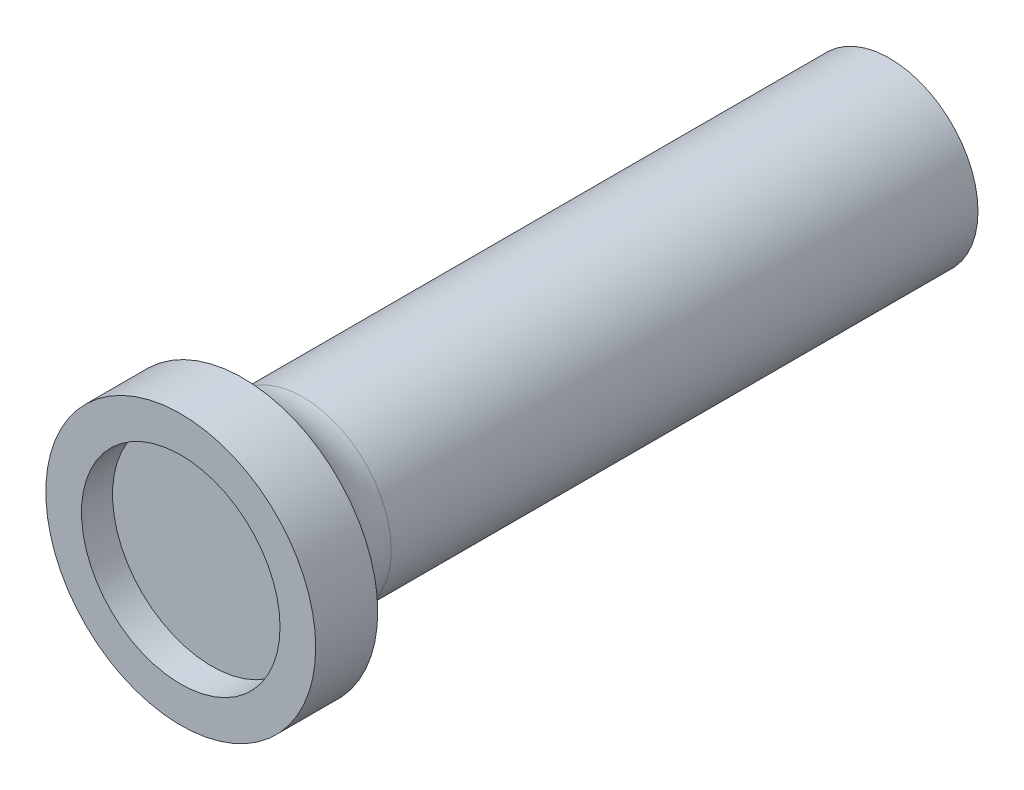
ISO-10303-21;
HEADER;
FILE_DESCRIPTION(('STEP AP214'),'2;1');
FILE_NAME('part.step','',(''),(''),'','','');
FILE_SCHEMA(('AUTOMOTIVE_DESIGN { 1 0 10303 214 1 1 1 1 }'));
ENDSEC;
DATA;
#1=APPLICATION_CONTEXT('core data for automotive mechanical design processes');
#2=APPLICATION_PROTOCOL_DEFINITION('international standard','automotive_design',2000,#1);
#3=PRODUCT_CONTEXT('',#1,'mechanical');
#4=PRODUCT('Part','Part','',(#3));
#5=PRODUCT_RELATED_PRODUCT_CATEGORY('part','',(#4));
#6=PRODUCT_DEFINITION_FORMATION('','',#4);
#7=PRODUCT_DEFINITION_CONTEXT('part definition',#1,'design');
#8=PRODUCT_DEFINITION('design','',#6,#7);
#9=PRODUCT_DEFINITION_SHAPE('','',#8);
#10=(LENGTH_UNIT() NAMED_UNIT(*) SI_UNIT(.MILLI.,.METRE.));
#11=(NAMED_UNIT(*) PLANE_ANGLE_UNIT() SI_UNIT($,.RADIAN.));
#12=(NAMED_UNIT(*) SI_UNIT($,.STERADIAN.) SOLID_ANGLE_UNIT());
#13=UNCERTAINTY_MEASURE_WITH_UNIT(LENGTH_MEASURE(1.E-05),#10,'distance_accuracy_value','');
#14=(GEOMETRIC_REPRESENTATION_CONTEXT(3) GLOBAL_UNCERTAINTY_ASSIGNED_CONTEXT((#13)) GLOBAL_UNIT_ASSIGNED_CONTEXT((#10,
#11,#12)) REPRESENTATION_CONTEXT('',''));
#15=CARTESIAN_POINT('',(0.,0.,0.));
#16=DIRECTION('',(0.,0.,1.));
#17=DIRECTION('',(1.,0.,0.));
#18=AXIS2_PLACEMENT_3D('',#15,#16,#17);
#19=CARTESIAN_POINT('',(0.,0.,20.85));
#20=DIRECTION('',(0.,0.,-1.));
#21=DIRECTION('',(-1.,0.,0.));
#22=AXIS2_PLACEMENT_3D('',#19,#20,#21);
#23=CYLINDRICAL_SURFACE('',#22,2.85);
#24=CARTESIAN_POINT('',(0.,0.,18.9135083268963));
#25=DIRECTION('',(0.,0.,1.));
#26=DIRECTION('',(1.,0.,0.));
#27=AXIS2_PLACEMENT_3D('',#24,#25,#26);
#28=CIRCLE('',#27,2.85);
#29=CARTESIAN_POINT('',(2.85,0.,18.9135083268963));
#30=VERTEX_POINT('',#29);
#31=EDGE_CURVE('E34',#30,#30,#28,.F.);
#32=ORIENTED_EDGE('',*,*,#31,.T.);
#33=EDGE_LOOP('',(#32));
#34=FACE_BOUND('',#33,.T.);
#35=CARTESIAN_POINT('',(0.,0.,0.));
#36=DIRECTION('',(0.,0.,1.));
#37=DIRECTION('',(1.,0.,0.));
#38=AXIS2_PLACEMENT_3D('',#35,#36,#37);
#39=CIRCLE('',#38,2.85);
#40=CARTESIAN_POINT('',(2.85,0.,0.));
#41=VERTEX_POINT('',#40);
#42=EDGE_CURVE('E42',#41,#41,#39,.T.);
#43=ORIENTED_EDGE('',*,*,#42,.T.);
#44=EDGE_LOOP('',(#43));
#45=FACE_BOUND('',#44,.T.);
#46=ADVANCED_FACE('F30',(#34,#45),#23,.T.);
#47=CARTESIAN_POINT('',(0.,0.,0.));
#48=DIRECTION('',(0.,0.,1.));
#49=DIRECTION('',(1.,0.,0.));
#50=AXIS2_PLACEMENT_3D('',#47,#48,#49);
#51=PLANE('',#50);
#52=CARTESIAN_POINT('',(0.,0.,0.));
#53=DIRECTION('',(0.,0.,-1.));
#54=DIRECTION('',(-1.,0.,0.));
#55=AXIS2_PLACEMENT_3D('',#52,#53,#54);
#56=CIRCLE('',#55,0.8);
#57=CARTESIAN_POINT('',(-0.8,0.,0.));
#58=VERTEX_POINT('',#57);
#59=EDGE_CURVE('E10',#58,#58,#56,.T.);
#60=ORIENTED_EDGE('',*,*,#59,.F.);
#61=EDGE_LOOP('',(#60));
#62=FACE_BOUND('',#61,.T.);
#63=ORIENTED_EDGE('',*,*,#42,.F.);
#64=EDGE_LOOP('',(#63));
#65=FACE_BOUND('',#64,.T.);
#66=ADVANCED_FACE('F61',(#62,#65),#51,.F.);
#67=CARTESIAN_POINT('',(0.,0.,22.85));
#68=DIRECTION('',(0.,0.,-1.));
#69=DIRECTION('',(-1.,0.,0.));
#70=AXIS2_PLACEMENT_3D('',#67,#68,#69);
#71=CYLINDRICAL_SURFACE('',#70,4.35);
#72=CARTESIAN_POINT('',(0.,0.,22.85));
#73=DIRECTION('',(0.,0.,1.));
#74=DIRECTION('',(1.,0.,0.));
#75=AXIS2_PLACEMENT_3D('',#72,#73,#74);
#76=CIRCLE('',#75,4.35);
#77=CARTESIAN_POINT('',(4.35,0.,22.85));
#78=VERTEX_POINT('',#77);
#79=EDGE_CURVE('E53',#78,#78,#76,.T.);
#80=ORIENTED_EDGE('',*,*,#79,.F.);
#81=EDGE_LOOP('',(#80));
#82=FACE_BOUND('',#81,.T.);
#83=CARTESIAN_POINT('',(0.,0.,20.85));
#84=DIRECTION('',(0.,0.,1.));
#85=DIRECTION('',(1.,0.,0.));
#86=AXIS2_PLACEMENT_3D('',#83,#84,#85);
#87=CIRCLE('',#86,4.35);
#88=CARTESIAN_POINT('',(4.35,0.,20.85));
#89=VERTEX_POINT('',#88);
#90=EDGE_CURVE('E49',#89,#89,#87,.T.);
#91=ORIENTED_EDGE('',*,*,#90,.T.);
#92=EDGE_LOOP('',(#91));
#93=FACE_BOUND('',#92,.T.);
#94=ADVANCED_FACE('F63',(#82,#93),#71,.T.);
#95=CARTESIAN_POINT('',(0.,0.,22.85));
#96=DIRECTION('',(0.,0.,1.));
#97=DIRECTION('',(1.,0.,0.));
#98=AXIS2_PLACEMENT_3D('',#95,#96,#97);
#99=PLANE('',#98);
#100=CARTESIAN_POINT('',(0.,0.,22.85));
#101=DIRECTION('',(0.,0.,1.));
#102=DIRECTION('',(1.,0.,0.));
#103=AXIS2_PLACEMENT_3D('',#100,#101,#102);
#104=CIRCLE('',#103,3.2);
#105=CARTESIAN_POINT('',(3.2,0.,22.85));
#106=VERTEX_POINT('',#105);
#107=EDGE_CURVE('E50',#106,#106,#104,.T.);
#108=ORIENTED_EDGE('',*,*,#107,.F.);
#109=EDGE_LOOP('',(#108));
#110=FACE_BOUND('',#109,.T.);
#111=ORIENTED_EDGE('',*,*,#79,.T.);
#112=EDGE_LOOP('',(#111));
#113=FACE_BOUND('',#112,.T.);
#114=ADVANCED_FACE('F70',(#110,#113),#99,.T.);
#115=CARTESIAN_POINT('',(0.,0.,21.85));
#116=DIRECTION('',(0.,0.,1.));
#117=DIRECTION('',(1.,0.,0.));
#118=AXIS2_PLACEMENT_3D('',#115,#116,#117);
#119=CYLINDRICAL_SURFACE('',#118,3.2);
#120=CARTESIAN_POINT('',(0.,0.,21.85));
#121=DIRECTION('',(0.,0.,1.));
#122=DIRECTION('',(1.,0.,0.));
#123=AXIS2_PLACEMENT_3D('',#120,#121,#122);
#124=CIRCLE('',#123,3.2);
#125=CARTESIAN_POINT('',(3.2,0.,21.85));
#126=VERTEX_POINT('',#125);
#127=EDGE_CURVE('E46',#126,#126,#124,.T.);
#128=ORIENTED_EDGE('',*,*,#127,.F.);
#129=EDGE_LOOP('',(#128));
#130=FACE_BOUND('',#129,.T.);
#131=ORIENTED_EDGE('',*,*,#107,.T.);
#132=EDGE_LOOP('',(#131));
#133=FACE_BOUND('',#132,.T.);
#134=ADVANCED_FACE('F77',(#130,#133),#119,.F.);
#135=CARTESIAN_POINT('',(0.,0.,21.85));
#136=DIRECTION('',(0.,0.,1.));
#137=DIRECTION('',(1.,0.,0.));
#138=AXIS2_PLACEMENT_3D('',#135,#136,#137);
#139=PLANE('',#138);
#140=ORIENTED_EDGE('',*,*,#127,.T.);
#141=EDGE_LOOP('',(#140));
#142=FACE_BOUND('',#141,.T.);
#143=ADVANCED_FACE('F81',(#142),#139,.T.);
#144=CARTESIAN_POINT('',(0.,0.,18.9135083268963));
#145=DIRECTION('',(0.,0.,1.));
#146=DIRECTION('',(1.,0.,0.));
#147=AXIS2_PLACEMENT_3D('',#144,#145,#146);
#148=TOROIDAL_SURFACE('',#147,4.85,2.);
#149=ORIENTED_EDGE('',*,*,#31,.F.);
#150=EDGE_LOOP('',(#149));
#151=FACE_BOUND('',#150,.T.);
#152=ORIENTED_EDGE('',*,*,#90,.F.);
#153=EDGE_LOOP('',(#152));
#154=FACE_BOUND('',#153,.T.);
#155=ADVANCED_FACE('F32',(#151,#154),#148,.F.);
#156=CARTESIAN_POINT('',(0.,0.,-0.8));
#157=DIRECTION('',(0.,0.,1.));
#158=DIRECTION('',(1.,0.,0.));
#159=AXIS2_PLACEMENT_3D('',#156,#157,#158);
#160=CYLINDRICAL_SURFACE('',#159,0.8);
#161=CARTESIAN_POINT('',(0.,0.,-0.8));
#162=DIRECTION('',(0.,0.,-1.));
#163=DIRECTION('',(-1.,0.,0.));
#164=AXIS2_PLACEMENT_3D('',#161,#162,#163);
#165=CIRCLE('',#164,0.8);
#166=CARTESIAN_POINT('',(-0.8,0.,-0.8));
#167=VERTEX_POINT('',#166);
#168=EDGE_CURVE('E45',#167,#167,#165,.T.);
#169=ORIENTED_EDGE('',*,*,#168,.F.);
#170=EDGE_LOOP('',(#169));
#171=FACE_BOUND('',#170,.T.);
#172=ORIENTED_EDGE('',*,*,#59,.T.);
#173=EDGE_LOOP('',(#172));
#174=FACE_BOUND('',#173,.T.);
#175=ADVANCED_FACE('F86',(#171,#174),#160,.T.);
#176=CARTESIAN_POINT('',(0.,0.,-0.8));
#177=DIRECTION('',(0.,0.,-1.));
#178=DIRECTION('',(-1.,0.,0.));
#179=AXIS2_PLACEMENT_3D('',#176,#177,#178);
#180=PLANE('',#179);
#181=ORIENTED_EDGE('',*,*,#168,.T.);
#182=EDGE_LOOP('',(#181));
#183=FACE_BOUND('',#182,.T.);
#184=ADVANCED_FACE('F89',(#183),#180,.T.);
#185=CLOSED_SHELL('',(#46,#66,#94,#114,#134,#143,#155,#175,#184));
#186=MANIFOLD_SOLID_BREP('B2',#185);
#187=ADVANCED_BREP_SHAPE_REPRESENTATION('',(#18,#186),#14);
#188=SHAPE_DEFINITION_REPRESENTATION(#9,#187);
ENDSEC;
END-ISO-10303-21;
